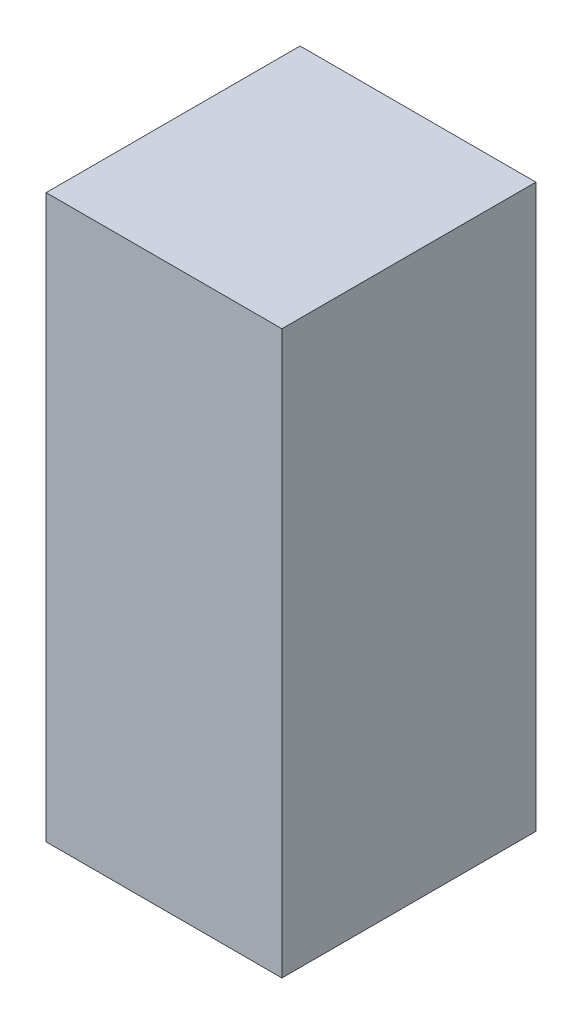
ISO-10303-21;
HEADER;
FILE_DESCRIPTION(('STEP AP214'),'2;1');
FILE_NAME('part.step','',(''),(''),'','','');
FILE_SCHEMA(('AUTOMOTIVE_DESIGN { 1 0 10303 214 1 1 1 1 }'));
ENDSEC;
DATA;
#1=APPLICATION_CONTEXT('core data for automotive mechanical design processes');
#2=APPLICATION_PROTOCOL_DEFINITION('international standard','automotive_design',2000,#1);
#3=PRODUCT_CONTEXT('',#1,'mechanical');
#4=PRODUCT('Part','Part','',(#3));
#5=PRODUCT_RELATED_PRODUCT_CATEGORY('part','',(#4));
#6=PRODUCT_DEFINITION_FORMATION('','',#4);
#7=PRODUCT_DEFINITION_CONTEXT('part definition',#1,'design');
#8=PRODUCT_DEFINITION('design','',#6,#7);
#9=PRODUCT_DEFINITION_SHAPE('','',#8);
#10=(LENGTH_UNIT() NAMED_UNIT(*) SI_UNIT(.MILLI.,.METRE.));
#11=(NAMED_UNIT(*) PLANE_ANGLE_UNIT() SI_UNIT($,.RADIAN.));
#12=(NAMED_UNIT(*) SI_UNIT($,.STERADIAN.) SOLID_ANGLE_UNIT());
#13=UNCERTAINTY_MEASURE_WITH_UNIT(LENGTH_MEASURE(1.E-05),#10,'distance_accuracy_value','');
#14=(GEOMETRIC_REPRESENTATION_CONTEXT(3) GLOBAL_UNCERTAINTY_ASSIGNED_CONTEXT((#13)) GLOBAL_UNIT_ASSIGNED_CONTEXT((#10,
#11,#12)) REPRESENTATION_CONTEXT('',''));
#15=CARTESIAN_POINT('',(0.,0.,0.));
#16=DIRECTION('',(0.,0.,1.));
#17=DIRECTION('',(1.,0.,0.));
#18=AXIS2_PLACEMENT_3D('',#15,#16,#17);
#19=CARTESIAN_POINT('',(-130.,310.,140.));
#20=DIRECTION('',(1.,0.,0.));
#21=DIRECTION('',(0.,1.,0.));
#22=AXIS2_PLACEMENT_3D('',#19,#20,#21);
#23=PLANE('',#22);
#24=DIRECTION('',(0.,-1.,0.));
#25=VECTOR('',#24,1.);
#26=CARTESIAN_POINT('',(-130.,310.,0.));
#27=LINE('',#26,#25);
#28=CARTESIAN_POINT('',(-130.,310.,0.));
#29=VERTEX_POINT('',#28);
#30=CARTESIAN_POINT('',(-130.,0.,0.));
#31=VERTEX_POINT('',#30);
#32=EDGE_CURVE('E96',#29,#31,#27,.T.);
#33=ORIENTED_EDGE('',*,*,#32,.T.);
#34=DIRECTION('',(0.,0.,-1.));
#35=VECTOR('',#34,1.);
#36=CARTESIAN_POINT('',(-130.,0.,140.));
#37=LINE('',#36,#35);
#38=CARTESIAN_POINT('',(-130.,0.,140.));
#39=VERTEX_POINT('',#38);
#40=EDGE_CURVE('E11',#39,#31,#37,.T.);
#41=ORIENTED_EDGE('',*,*,#40,.F.);
#42=DIRECTION('',(0.,-1.,0.));
#43=VECTOR('',#42,1.);
#44=CARTESIAN_POINT('',(-130.,310.,140.));
#45=LINE('',#44,#43);
#46=CARTESIAN_POINT('',(-130.,310.,140.));
#47=VERTEX_POINT('',#46);
#48=EDGE_CURVE('E84',#47,#39,#45,.T.);
#49=ORIENTED_EDGE('',*,*,#48,.F.);
#50=DIRECTION('',(0.,0.,-1.));
#51=VECTOR('',#50,1.);
#52=CARTESIAN_POINT('',(-130.,310.,140.));
#53=LINE('',#52,#51);
#54=EDGE_CURVE('E92',#47,#29,#53,.T.);
#55=ORIENTED_EDGE('',*,*,#54,.T.);
#56=EDGE_LOOP('',(#33,#41,#49,#55));
#57=FACE_BOUND('',#56,.T.);
#58=ADVANCED_FACE('F33',(#57),#23,.F.);
#59=CARTESIAN_POINT('',(-130.,0.,140.));
#60=DIRECTION('',(0.,1.,0.));
#61=DIRECTION('',(0.,0.,1.));
#62=AXIS2_PLACEMENT_3D('',#59,#60,#61);
#63=PLANE('',#62);
#64=DIRECTION('',(1.,0.,0.));
#65=VECTOR('',#64,1.);
#66=CARTESIAN_POINT('',(-130.,0.,0.));
#67=LINE('',#66,#65);
#68=CARTESIAN_POINT('',(0.,0.,0.));
#69=VERTEX_POINT('',#68);
#70=EDGE_CURVE('E88',#31,#69,#67,.T.);
#71=ORIENTED_EDGE('',*,*,#70,.T.);
#72=DIRECTION('',(0.,0.,-1.));
#73=VECTOR('',#72,1.);
#74=CARTESIAN_POINT('',(0.,0.,140.));
#75=LINE('',#74,#73);
#76=CARTESIAN_POINT('',(0.,0.,140.));
#77=VERTEX_POINT('',#76);
#78=EDGE_CURVE('E41',#77,#69,#75,.T.);
#79=ORIENTED_EDGE('',*,*,#78,.F.);
#80=DIRECTION('',(1.,0.,0.));
#81=VECTOR('',#80,1.);
#82=CARTESIAN_POINT('',(-130.,0.,140.));
#83=LINE('',#82,#81);
#84=EDGE_CURVE('E79',#39,#77,#83,.T.);
#85=ORIENTED_EDGE('',*,*,#84,.F.);
#86=ORIENTED_EDGE('',*,*,#40,.T.);
#87=EDGE_LOOP('',(#71,#79,#85,#86));
#88=FACE_BOUND('',#87,.T.);
#89=ADVANCED_FACE('F87',(#88),#63,.F.);
#90=CARTESIAN_POINT('',(0.,310.,140.));
#91=DIRECTION('',(-1.,0.,0.));
#92=DIRECTION('',(0.,-1.,0.));
#93=AXIS2_PLACEMENT_3D('',#90,#91,#92);
#94=PLANE('',#93);
#95=DIRECTION('',(0.,1.,0.));
#96=VECTOR('',#95,1.);
#97=CARTESIAN_POINT('',(0.,310.,0.));
#98=LINE('',#97,#96);
#99=CARTESIAN_POINT('',(0.,310.,0.));
#100=VERTEX_POINT('',#99);
#101=EDGE_CURVE('E66',#69,#100,#98,.T.);
#102=ORIENTED_EDGE('',*,*,#101,.T.);
#103=DIRECTION('',(0.,0.,-1.));
#104=VECTOR('',#103,1.);
#105=CARTESIAN_POINT('',(0.,310.,140.));
#106=LINE('',#105,#104);
#107=CARTESIAN_POINT('',(0.,310.,140.));
#108=VERTEX_POINT('',#107);
#109=EDGE_CURVE('E89',#108,#100,#106,.T.);
#110=ORIENTED_EDGE('',*,*,#109,.F.);
#111=DIRECTION('',(0.,1.,0.));
#112=VECTOR('',#111,1.);
#113=CARTESIAN_POINT('',(0.,310.,140.));
#114=LINE('',#113,#112);
#115=EDGE_CURVE('E82',#77,#108,#114,.T.);
#116=ORIENTED_EDGE('',*,*,#115,.F.);
#117=ORIENTED_EDGE('',*,*,#78,.T.);
#118=EDGE_LOOP('',(#102,#110,#116,#117));
#119=FACE_BOUND('',#118,.T.);
#120=ADVANCED_FACE('F90',(#119),#94,.F.);
#121=CARTESIAN_POINT('',(-130.,310.,140.));
#122=DIRECTION('',(0.,-1.,0.));
#123=DIRECTION('',(0.,0.,-1.));
#124=AXIS2_PLACEMENT_3D('',#121,#122,#123);
#125=PLANE('',#124);
#126=DIRECTION('',(-1.,0.,0.));
#127=VECTOR('',#126,1.);
#128=CARTESIAN_POINT('',(-130.,310.,0.));
#129=LINE('',#128,#127);
#130=EDGE_CURVE('E72',#100,#29,#129,.T.);
#131=ORIENTED_EDGE('',*,*,#130,.T.);
#132=ORIENTED_EDGE('',*,*,#54,.F.);
#133=DIRECTION('',(-1.,0.,0.));
#134=VECTOR('',#133,1.);
#135=CARTESIAN_POINT('',(-130.,310.,140.));
#136=LINE('',#135,#134);
#137=EDGE_CURVE('E49',#108,#47,#136,.T.);
#138=ORIENTED_EDGE('',*,*,#137,.F.);
#139=ORIENTED_EDGE('',*,*,#109,.T.);
#140=EDGE_LOOP('',(#131,#132,#138,#139));
#141=FACE_BOUND('',#140,.T.);
#142=ADVANCED_FACE('F103',(#141),#125,.F.);
#143=CARTESIAN_POINT('',(0.,0.,140.));
#144=DIRECTION('',(0.,0.,1.));
#145=DIRECTION('',(1.,0.,0.));
#146=AXIS2_PLACEMENT_3D('',#143,#144,#145);
#147=PLANE('',#146);
#148=ORIENTED_EDGE('',*,*,#48,.T.);
#149=ORIENTED_EDGE('',*,*,#84,.T.);
#150=ORIENTED_EDGE('',*,*,#115,.T.);
#151=ORIENTED_EDGE('',*,*,#137,.T.);
#152=EDGE_LOOP('',(#148,#149,#150,#151));
#153=FACE_BOUND('',#152,.T.);
#154=ADVANCED_FACE('F80',(#153),#147,.T.);
#155=CARTESIAN_POINT('',(0.,0.,0.));
#156=DIRECTION('',(0.,0.,1.));
#157=DIRECTION('',(1.,0.,0.));
#158=AXIS2_PLACEMENT_3D('',#155,#156,#157);
#159=PLANE('',#158);
#160=ORIENTED_EDGE('',*,*,#32,.F.);
#161=ORIENTED_EDGE('',*,*,#130,.F.);
#162=ORIENTED_EDGE('',*,*,#101,.F.);
#163=ORIENTED_EDGE('',*,*,#70,.F.);
#164=EDGE_LOOP('',(#160,#161,#162,#163));
#165=FACE_BOUND('',#164,.T.);
#166=ADVANCED_FACE('F106',(#165),#159,.F.);
#167=CLOSED_SHELL('',(#58,#89,#120,#142,#154,#166));
#168=MANIFOLD_SOLID_BREP('B2',#167);
#169=ADVANCED_BREP_SHAPE_REPRESENTATION('',(#18,#168),#14);
#170=SHAPE_DEFINITION_REPRESENTATION(#9,#169);
ENDSEC;
END-ISO-10303-21;
